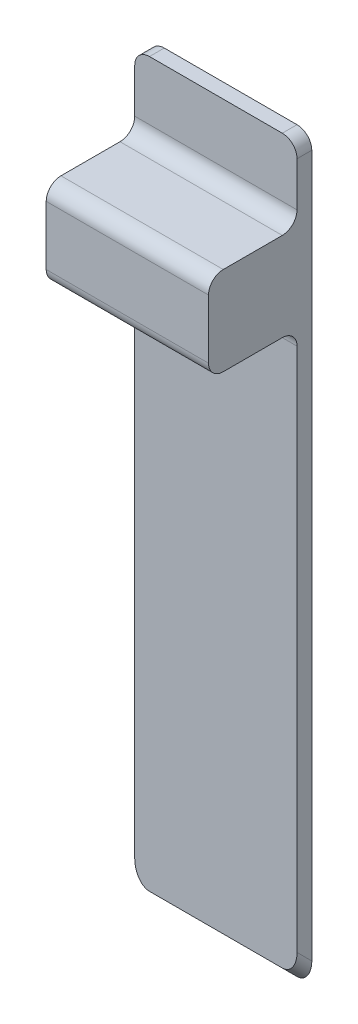
ISO-10303-21;
HEADER;
FILE_DESCRIPTION(('STEP AP214'),'2;1');
FILE_NAME('part.step','',(''),(''),'','','');
FILE_SCHEMA(('AUTOMOTIVE_DESIGN { 1 0 10303 214 1 1 1 1 }'));
ENDSEC;
DATA;
#1=APPLICATION_CONTEXT('core data for automotive mechanical design processes');
#2=APPLICATION_PROTOCOL_DEFINITION('international standard','automotive_design',2000,#1);
#3=PRODUCT_CONTEXT('',#1,'mechanical');
#4=PRODUCT('Part','Part','',(#3));
#5=PRODUCT_RELATED_PRODUCT_CATEGORY('part','',(#4));
#6=PRODUCT_DEFINITION_FORMATION('','',#4);
#7=PRODUCT_DEFINITION_CONTEXT('part definition',#1,'design');
#8=PRODUCT_DEFINITION('design','',#6,#7);
#9=PRODUCT_DEFINITION_SHAPE('','',#8);
#10=(LENGTH_UNIT() NAMED_UNIT(*) SI_UNIT(.MILLI.,.METRE.));
#11=(NAMED_UNIT(*) PLANE_ANGLE_UNIT() SI_UNIT($,.RADIAN.));
#12=(NAMED_UNIT(*) SI_UNIT($,.STERADIAN.) SOLID_ANGLE_UNIT());
#13=UNCERTAINTY_MEASURE_WITH_UNIT(LENGTH_MEASURE(1.E-05),#10,'distance_accuracy_value','');
#14=(GEOMETRIC_REPRESENTATION_CONTEXT(3) GLOBAL_UNCERTAINTY_ASSIGNED_CONTEXT((#13)) GLOBAL_UNIT_ASSIGNED_CONTEXT((#10,
#11,#12)) REPRESENTATION_CONTEXT('',''));
#15=CARTESIAN_POINT('',(0.,0.,0.));
#16=DIRECTION('',(0.,0.,1.));
#17=DIRECTION('',(1.,0.,0.));
#18=AXIS2_PLACEMENT_3D('',#15,#16,#17);
#19=CARTESIAN_POINT('',(0.,0.,1.));
#20=DIRECTION('',(0.,0.,1.));
#21=DIRECTION('',(1.,0.,0.));
#22=AXIS2_PLACEMENT_3D('',#19,#20,#21);
#23=PLANE('',#22);
#24=DIRECTION('',(-1.,0.,0.));
#25=VECTOR('',#24,1.);
#26=CARTESIAN_POINT('',(-5.5,25.,1.));
#27=LINE('',#26,#25);
#28=CARTESIAN_POINT('',(4.5,25.,1.));
#29=VERTEX_POINT('',#28);
#30=CARTESIAN_POINT('',(-4.5,25.,1.));
#31=VERTEX_POINT('',#30);
#32=EDGE_CURVE('E192',#29,#31,#27,.T.);
#33=ORIENTED_EDGE('',*,*,#32,.T.);
#34=CARTESIAN_POINT('',(-4.5,24.,1.));
#35=DIRECTION('',(0.,0.,1.));
#36=DIRECTION('',(1.,0.,0.));
#37=AXIS2_PLACEMENT_3D('',#34,#35,#36);
#38=CIRCLE('',#37,1.);
#39=CARTESIAN_POINT('',(-5.5,24.,1.));
#40=VERTEX_POINT('',#39);
#41=EDGE_CURVE('E219',#31,#40,#38,.T.);
#42=ORIENTED_EDGE('',*,*,#41,.T.);
#43=DIRECTION('',(0.,-1.,0.));
#44=VECTOR('',#43,1.);
#45=CARTESIAN_POINT('',(-5.5,25.,1.));
#46=LINE('',#45,#44);
#47=CARTESIAN_POINT('',(-5.5,21.,1.));
#48=VERTEX_POINT('',#47);
#49=EDGE_CURVE('E175',#40,#48,#46,.T.);
#50=ORIENTED_EDGE('',*,*,#49,.T.);
#51=DIRECTION('',(-1.,0.,0.));
#52=VECTOR('',#51,1.);
#53=CARTESIAN_POINT('',(0.,21.,1.));
#54=LINE('',#53,#52);
#55=CARTESIAN_POINT('',(5.5,21.,1.));
#56=VERTEX_POINT('',#55);
#57=EDGE_CURVE('E215',#48,#56,#54,.F.);
#58=ORIENTED_EDGE('',*,*,#57,.T.);
#59=DIRECTION('',(0.,1.,0.));
#60=VECTOR('',#59,1.);
#61=CARTESIAN_POINT('',(5.5,25.,1.));
#62=LINE('',#61,#60);
#63=CARTESIAN_POINT('',(5.5,24.,1.));
#64=VERTEX_POINT('',#63);
#65=EDGE_CURVE('E267',#56,#64,#62,.T.);
#66=ORIENTED_EDGE('',*,*,#65,.T.);
#67=CARTESIAN_POINT('',(4.5,24.,1.));
#68=DIRECTION('',(0.,0.,1.));
#69=DIRECTION('',(1.,0.,0.));
#70=AXIS2_PLACEMENT_3D('',#67,#68,#69);
#71=CIRCLE('',#70,1.);
#72=EDGE_CURVE('E217',#64,#29,#71,.T.);
#73=ORIENTED_EDGE('',*,*,#72,.T.);
#74=EDGE_LOOP('',(#33,#42,#50,#58,#66,#73));
#75=FACE_BOUND('',#74,.T.);
#76=ADVANCED_FACE('F41',(#75),#23,.T.);
#77=CARTESIAN_POINT('',(-5.5,25.,1.));
#78=DIRECTION('',(1.,0.,0.));
#79=DIRECTION('',(0.,1.,0.));
#80=AXIS2_PLACEMENT_3D('',#77,#78,#79);
#81=PLANE('',#80);
#82=ORIENTED_EDGE('',*,*,#49,.F.);
#83=DIRECTION('',(0.,0.,-1.));
#84=VECTOR('',#83,1.);
#85=CARTESIAN_POINT('',(-5.5,24.,1.));
#86=LINE('',#85,#84);
#87=CARTESIAN_POINT('',(-5.5,24.,0.));
#88=VERTEX_POINT('',#87);
#89=EDGE_CURVE('E158',#40,#88,#86,.T.);
#90=ORIENTED_EDGE('',*,*,#89,.T.);
#91=DIRECTION('',(0.,-1.,0.));
#92=VECTOR('',#91,1.);
#93=CARTESIAN_POINT('',(-5.5,25.,0.));
#94=LINE('',#93,#92);
#95=CARTESIAN_POINT('',(-5.5,-23.5857864376269,0.));
#96=VERTEX_POINT('',#95);
#97=EDGE_CURVE('E172',#88,#96,#94,.T.);
#98=ORIENTED_EDGE('',*,*,#97,.T.);
#99=DIRECTION('',(0.,0.707106781186545,0.70710678118655));
#100=VECTOR('',#99,1.);
#101=CARTESIAN_POINT('',(-5.5,-23.2928932188135,0.292893218813459));
#102=LINE('',#101,#100);
#103=CARTESIAN_POINT('',(-5.5,-22.5857864376269,1.));
#104=VERTEX_POINT('',#103);
#105=EDGE_CURVE('E177',#96,#104,#102,.T.);
#106=ORIENTED_EDGE('',*,*,#105,.T.);
#107=CARTESIAN_POINT('',(-5.5,13.,1.));
#108=VERTEX_POINT('',#107);
#109=EDGE_CURVE('E199',#108,#104,#46,.T.);
#110=ORIENTED_EDGE('',*,*,#109,.F.);
#111=CARTESIAN_POINT('',(-5.5,13.,2.));
#112=DIRECTION('',(1.,0.,0.));
#113=DIRECTION('',(0.,1.,0.));
#114=AXIS2_PLACEMENT_3D('',#111,#112,#113);
#115=CIRCLE('',#114,1.);
#116=CARTESIAN_POINT('',(-5.5,14.,2.));
#117=VERTEX_POINT('',#116);
#118=EDGE_CURVE('E11',#108,#117,#115,.T.);
#119=ORIENTED_EDGE('',*,*,#118,.T.);
#120=DIRECTION('',(0.,0.,-1.));
#121=VECTOR('',#120,1.);
#122=CARTESIAN_POINT('',(-5.5,14.,7.));
#123=LINE('',#122,#121);
#124=CARTESIAN_POINT('',(-5.5,14.,6.));
#125=VERTEX_POINT('',#124);
#126=EDGE_CURVE('E183',#125,#117,#123,.T.);
#127=ORIENTED_EDGE('',*,*,#126,.F.);
#128=CARTESIAN_POINT('',(-5.5,15.,6.));
#129=DIRECTION('',(1.,0.,0.));
#130=DIRECTION('',(0.,1.,0.));
#131=AXIS2_PLACEMENT_3D('',#128,#129,#130);
#132=CIRCLE('',#131,1.);
#133=CARTESIAN_POINT('',(-5.5,15.,7.));
#134=VERTEX_POINT('',#133);
#135=EDGE_CURVE('E205',#125,#134,#132,.F.);
#136=ORIENTED_EDGE('',*,*,#135,.T.);
#137=DIRECTION('',(0.,-1.,0.));
#138=VECTOR('',#137,1.);
#139=CARTESIAN_POINT('',(-5.5,20.,7.));
#140=LINE('',#139,#138);
#141=CARTESIAN_POINT('',(-5.5,19.,7.));
#142=VERTEX_POINT('',#141);
#143=EDGE_CURVE('E279',#142,#134,#140,.T.);
#144=ORIENTED_EDGE('',*,*,#143,.F.);
#145=CARTESIAN_POINT('',(-5.5,19.,6.));
#146=DIRECTION('',(1.,0.,0.));
#147=DIRECTION('',(0.,1.,0.));
#148=AXIS2_PLACEMENT_3D('',#145,#146,#147);
#149=CIRCLE('',#148,1.);
#150=CARTESIAN_POINT('',(-5.5,20.,6.));
#151=VERTEX_POINT('',#150);
#152=EDGE_CURVE('E203',#142,#151,#149,.F.);
#153=ORIENTED_EDGE('',*,*,#152,.T.);
#154=DIRECTION('',(0.,0.,-1.));
#155=VECTOR('',#154,1.);
#156=CARTESIAN_POINT('',(-5.5,20.,7.));
#157=LINE('',#156,#155);
#158=CARTESIAN_POINT('',(-5.5,20.,2.));
#159=VERTEX_POINT('',#158);
#160=EDGE_CURVE('E286',#151,#159,#157,.T.);
#161=ORIENTED_EDGE('',*,*,#160,.T.);
#162=CARTESIAN_POINT('',(-5.5,21.,2.));
#163=DIRECTION('',(1.,0.,0.));
#164=DIRECTION('',(0.,1.,0.));
#165=AXIS2_PLACEMENT_3D('',#162,#163,#164);
#166=CIRCLE('',#165,1.);
#167=EDGE_CURVE('E254',#159,#48,#166,.T.);
#168=ORIENTED_EDGE('',*,*,#167,.T.);
#169=EDGE_LOOP('',(#82,#90,#98,#106,#110,#119,#127,#136,#144,#153,#161,#168));
#170=FACE_BOUND('',#169,.T.);
#171=ADVANCED_FACE('F170',(#170),#81,.F.);
#172=CARTESIAN_POINT('',(5.5,25.,1.));
#173=DIRECTION('',(-1.,0.,0.));
#174=DIRECTION('',(0.,-1.,0.));
#175=AXIS2_PLACEMENT_3D('',#172,#173,#174);
#176=PLANE('',#175);
#177=CARTESIAN_POINT('',(5.5,-22.5857864376269,1.));
#178=VERTEX_POINT('',#177);
#179=CARTESIAN_POINT('',(5.5,13.,1.));
#180=VERTEX_POINT('',#179);
#181=EDGE_CURVE('E260',#178,#180,#62,.T.);
#182=ORIENTED_EDGE('',*,*,#181,.F.);
#183=DIRECTION('',(0.,-0.707106781186545,-0.70710678118655));
#184=VECTOR('',#183,1.);
#185=CARTESIAN_POINT('',(5.5,-24.2928932188135,-0.707106781186548));
#186=LINE('',#185,#184);
#187=CARTESIAN_POINT('',(5.5,-23.5857864376269,0.));
#188=VERTEX_POINT('',#187);
#189=EDGE_CURVE('E236',#178,#188,#186,.T.);
#190=ORIENTED_EDGE('',*,*,#189,.T.);
#191=DIRECTION('',(0.,1.,0.));
#192=VECTOR('',#191,1.);
#193=CARTESIAN_POINT('',(5.5,25.,0.));
#194=LINE('',#193,#192);
#195=CARTESIAN_POINT('',(5.5,24.,0.));
#196=VERTEX_POINT('',#195);
#197=EDGE_CURVE('E186',#188,#196,#194,.T.);
#198=ORIENTED_EDGE('',*,*,#197,.T.);
#199=DIRECTION('',(0.,0.,-1.));
#200=VECTOR('',#199,1.);
#201=CARTESIAN_POINT('',(5.5,24.,1.));
#202=LINE('',#201,#200);
#203=EDGE_CURVE('E234',#196,#64,#202,.F.);
#204=ORIENTED_EDGE('',*,*,#203,.T.);
#205=ORIENTED_EDGE('',*,*,#65,.F.);
#206=CARTESIAN_POINT('',(5.5,21.,2.));
#207=DIRECTION('',(-1.,0.,0.));
#208=DIRECTION('',(0.,-1.,0.));
#209=AXIS2_PLACEMENT_3D('',#206,#207,#208);
#210=CIRCLE('',#209,1.);
#211=CARTESIAN_POINT('',(5.50000000000001,20.,2.));
#212=VERTEX_POINT('',#211);
#213=EDGE_CURVE('E256',#56,#212,#210,.T.);
#214=ORIENTED_EDGE('',*,*,#213,.T.);
#215=DIRECTION('',(0.,0.,-1.));
#216=VECTOR('',#215,1.);
#217=CARTESIAN_POINT('',(5.50000000000001,20.,7.));
#218=LINE('',#217,#216);
#219=CARTESIAN_POINT('',(5.50000000000001,20.,6.));
#220=VERTEX_POINT('',#219);
#221=EDGE_CURVE('E291',#220,#212,#218,.T.);
#222=ORIENTED_EDGE('',*,*,#221,.F.);
#223=CARTESIAN_POINT('',(5.5,19.,6.));
#224=DIRECTION('',(-1.,0.,0.));
#225=DIRECTION('',(0.,-1.,0.));
#226=AXIS2_PLACEMENT_3D('',#223,#224,#225);
#227=CIRCLE('',#226,1.);
#228=CARTESIAN_POINT('',(5.50000000000001,19.,7.));
#229=VERTEX_POINT('',#228);
#230=EDGE_CURVE('E231',#220,#229,#227,.F.);
#231=ORIENTED_EDGE('',*,*,#230,.T.);
#232=DIRECTION('',(0.,1.,0.));
#233=VECTOR('',#232,1.);
#234=CARTESIAN_POINT('',(5.50000000000001,20.,7.));
#235=LINE('',#234,#233);
#236=CARTESIAN_POINT('',(5.5,15.,7.));
#237=VERTEX_POINT('',#236);
#238=EDGE_CURVE('E284',#237,#229,#235,.T.);
#239=ORIENTED_EDGE('',*,*,#238,.F.);
#240=CARTESIAN_POINT('',(5.5,15.,6.));
#241=DIRECTION('',(-1.,0.,0.));
#242=DIRECTION('',(0.,-1.,0.));
#243=AXIS2_PLACEMENT_3D('',#240,#241,#242);
#244=CIRCLE('',#243,1.);
#245=CARTESIAN_POINT('',(5.5,14.,6.));
#246=VERTEX_POINT('',#245);
#247=EDGE_CURVE('E63',#237,#246,#244,.F.);
#248=ORIENTED_EDGE('',*,*,#247,.T.);
#249=DIRECTION('',(0.,0.,-1.));
#250=VECTOR('',#249,1.);
#251=CARTESIAN_POINT('',(5.5,14.,7.));
#252=LINE('',#251,#250);
#253=CARTESIAN_POINT('',(5.5,14.,2.));
#254=VERTEX_POINT('',#253);
#255=EDGE_CURVE('E189',#246,#254,#252,.T.);
#256=ORIENTED_EDGE('',*,*,#255,.T.);
#257=CARTESIAN_POINT('',(5.5,13.,2.));
#258=DIRECTION('',(-1.,0.,0.));
#259=DIRECTION('',(0.,-1.,0.));
#260=AXIS2_PLACEMENT_3D('',#257,#258,#259);
#261=CIRCLE('',#260,1.);
#262=EDGE_CURVE('E49',#254,#180,#261,.T.);
#263=ORIENTED_EDGE('',*,*,#262,.T.);
#264=EDGE_LOOP('',(#182,#190,#198,#204,#205,#214,#222,#231,#239,#248,#256,#263));
#265=FACE_BOUND('',#264,.T.);
#266=ADVANCED_FACE('F259',(#265),#176,.F.);
#267=CARTESIAN_POINT('',(-5.5,25.,1.));
#268=DIRECTION('',(0.,-1.,0.));
#269=DIRECTION('',(0.,0.,-1.));
#270=AXIS2_PLACEMENT_3D('',#267,#268,#269);
#271=PLANE('',#270);
#272=DIRECTION('',(-1.,0.,0.));
#273=VECTOR('',#272,1.);
#274=CARTESIAN_POINT('',(-5.5,25.,0.));
#275=LINE('',#274,#273);
#276=CARTESIAN_POINT('',(4.5,25.,0.));
#277=VERTEX_POINT('',#276);
#278=CARTESIAN_POINT('',(-4.5,25.,0.));
#279=VERTEX_POINT('',#278);
#280=EDGE_CURVE('E197',#277,#279,#275,.T.);
#281=ORIENTED_EDGE('',*,*,#280,.T.);
#282=DIRECTION('',(0.,0.,-1.));
#283=VECTOR('',#282,1.);
#284=CARTESIAN_POINT('',(-4.5,25.,1.));
#285=LINE('',#284,#283);
#286=EDGE_CURVE('E159',#279,#31,#285,.F.);
#287=ORIENTED_EDGE('',*,*,#286,.T.);
#288=ORIENTED_EDGE('',*,*,#32,.F.);
#289=DIRECTION('',(0.,0.,-1.));
#290=VECTOR('',#289,1.);
#291=CARTESIAN_POINT('',(4.5,25.,1.));
#292=LINE('',#291,#290);
#293=EDGE_CURVE('E164',#29,#277,#292,.T.);
#294=ORIENTED_EDGE('',*,*,#293,.T.);
#295=EDGE_LOOP('',(#281,#287,#288,#294));
#296=FACE_BOUND('',#295,.T.);
#297=ADVANCED_FACE('F326',(#296),#271,.F.);
#298=ORIENTED_EDGE('',*,*,#109,.T.);
#299=CARTESIAN_POINT('',(-4.5,-22.5857864376269,1.));
#300=DIRECTION('',(0.,0.,1.));
#301=DIRECTION('',(0.,-1.,0.));
#302=AXIS2_PLACEMENT_3D('',#299,#300,#301);
#303=ELLIPSE('',#302,1.41421356237309,1.);
#304=CARTESIAN_POINT('',(-4.49999999999999,-24.,1.));
#305=VERTEX_POINT('',#304);
#306=EDGE_CURVE('E225',#104,#305,#303,.T.);
#307=ORIENTED_EDGE('',*,*,#306,.T.);
#308=DIRECTION('',(1.,0.,0.));
#309=VECTOR('',#308,1.);
#310=CARTESIAN_POINT('',(5.5,-24.,1.));
#311=LINE('',#310,#309);
#312=CARTESIAN_POINT('',(4.5,-24.,1.));
#313=VERTEX_POINT('',#312);
#314=EDGE_CURVE('E200',#305,#313,#311,.T.);
#315=ORIENTED_EDGE('',*,*,#314,.T.);
#316=CARTESIAN_POINT('',(4.5,-22.5857864376269,1.));
#317=DIRECTION('',(0.,0.,1.));
#318=DIRECTION('',(0.,1.,0.));
#319=AXIS2_PLACEMENT_3D('',#316,#317,#318);
#320=ELLIPSE('',#319,1.41421356237309,1.);
#321=EDGE_CURVE('E223',#313,#178,#320,.T.);
#322=ORIENTED_EDGE('',*,*,#321,.T.);
#323=ORIENTED_EDGE('',*,*,#181,.T.);
#324=DIRECTION('',(1.,0.,0.));
#325=VECTOR('',#324,1.);
#326=CARTESIAN_POINT('',(0.,13.,1.));
#327=LINE('',#326,#325);
#328=EDGE_CURVE('E221',#180,#108,#327,.F.);
#329=ORIENTED_EDGE('',*,*,#328,.T.);
#330=EDGE_LOOP('',(#298,#307,#315,#322,#323,#329));
#331=FACE_BOUND('',#330,.T.);
#332=ADVANCED_FACE('F264',(#331),#23,.T.);
#333=CARTESIAN_POINT('',(0.,0.,0.));
#334=DIRECTION('',(0.,0.,1.));
#335=DIRECTION('',(1.,0.,0.));
#336=AXIS2_PLACEMENT_3D('',#333,#334,#335);
#337=PLANE('',#336);
#338=ORIENTED_EDGE('',*,*,#97,.F.);
#339=CARTESIAN_POINT('',(-4.5,24.,0.));
#340=DIRECTION('',(0.,0.,1.));
#341=DIRECTION('',(1.,0.,0.));
#342=AXIS2_PLACEMENT_3D('',#339,#340,#341);
#343=CIRCLE('',#342,1.);
#344=EDGE_CURVE('E154',#88,#279,#343,.F.);
#345=ORIENTED_EDGE('',*,*,#344,.T.);
#346=ORIENTED_EDGE('',*,*,#280,.F.);
#347=CARTESIAN_POINT('',(4.5,24.,0.));
#348=DIRECTION('',(0.,0.,1.));
#349=DIRECTION('',(1.,0.,0.));
#350=AXIS2_PLACEMENT_3D('',#347,#348,#349);
#351=CIRCLE('',#350,1.);
#352=EDGE_CURVE('E176',#277,#196,#351,.F.);
#353=ORIENTED_EDGE('',*,*,#352,.T.);
#354=ORIENTED_EDGE('',*,*,#197,.F.);
#355=CARTESIAN_POINT('',(4.5,-23.5857864376269,0.));
#356=DIRECTION('',(0.,0.,1.));
#357=DIRECTION('',(0.,1.,0.));
#358=AXIS2_PLACEMENT_3D('',#355,#356,#357);
#359=ELLIPSE('',#358,1.41421356237309,1.);
#360=CARTESIAN_POINT('',(4.5,-25.,0.));
#361=VERTEX_POINT('',#360);
#362=EDGE_CURVE('E209',#188,#361,#359,.F.);
#363=ORIENTED_EDGE('',*,*,#362,.T.);
#364=DIRECTION('',(1.,0.,0.));
#365=VECTOR('',#364,1.);
#366=CARTESIAN_POINT('',(-5.5,-25.,0.));
#367=LINE('',#366,#365);
#368=CARTESIAN_POINT('',(-4.5,-25.,0.));
#369=VERTEX_POINT('',#368);
#370=EDGE_CURVE('E182',#369,#361,#367,.T.);
#371=ORIENTED_EDGE('',*,*,#370,.F.);
#372=CARTESIAN_POINT('',(-4.5,-23.5857864376269,0.));
#373=DIRECTION('',(0.,0.,1.));
#374=DIRECTION('',(0.,-1.,0.));
#375=AXIS2_PLACEMENT_3D('',#372,#373,#374);
#376=ELLIPSE('',#375,1.41421356237309,1.);
#377=EDGE_CURVE('E165',#369,#96,#376,.F.);
#378=ORIENTED_EDGE('',*,*,#377,.T.);
#379=EDGE_LOOP('',(#338,#345,#346,#353,#354,#363,#371,#378));
#380=FACE_BOUND('',#379,.T.);
#381=ADVANCED_FACE('F179',(#380),#337,.F.);
#382=CARTESIAN_POINT('',(0.,-24.,1.));
#383=DIRECTION('',(0.,-0.70710678118655,0.707106781186545));
#384=DIRECTION('',(-1.,0.,0.));
#385=AXIS2_PLACEMENT_3D('',#382,#383,#384);
#386=PLANE('',#385);
#387=ORIENTED_EDGE('',*,*,#314,.F.);
#388=DIRECTION('',(0.,0.707106781186545,0.70710678118655));
#389=VECTOR('',#388,1.);
#390=CARTESIAN_POINT('',(-4.5,-25.,0.));
#391=LINE('',#390,#389);
#392=EDGE_CURVE('E229',#305,#369,#391,.F.);
#393=ORIENTED_EDGE('',*,*,#392,.T.);
#394=ORIENTED_EDGE('',*,*,#370,.T.);
#395=DIRECTION('',(0.,-0.707106781186545,-0.70710678118655));
#396=VECTOR('',#395,1.);
#397=CARTESIAN_POINT('',(4.5,-24.,1.));
#398=LINE('',#397,#396);
#399=EDGE_CURVE('E227',#361,#313,#398,.F.);
#400=ORIENTED_EDGE('',*,*,#399,.T.);
#401=EDGE_LOOP('',(#387,#393,#394,#400));
#402=FACE_BOUND('',#401,.T.);
#403=ADVANCED_FACE('F302',(#402),#386,.T.);
#404=CARTESIAN_POINT('',(-5.5,14.,7.));
#405=DIRECTION('',(0.,1.,0.));
#406=DIRECTION('',(-1.,0.,0.));
#407=AXIS2_PLACEMENT_3D('',#404,#405,#406);
#408=PLANE('',#407);
#409=ORIENTED_EDGE('',*,*,#255,.F.);
#410=DIRECTION('',(1.,0.,0.));
#411=VECTOR('',#410,1.);
#412=CARTESIAN_POINT('',(-5.5,14.,6.));
#413=LINE('',#412,#411);
#414=EDGE_CURVE('E247',#246,#125,#413,.F.);
#415=ORIENTED_EDGE('',*,*,#414,.T.);
#416=ORIENTED_EDGE('',*,*,#126,.T.);
#417=DIRECTION('',(1.,0.,0.));
#418=VECTOR('',#417,1.);
#419=CARTESIAN_POINT('',(-5.5,14.,2.));
#420=LINE('',#419,#418);
#421=EDGE_CURVE('E245',#117,#254,#420,.T.);
#422=ORIENTED_EDGE('',*,*,#421,.T.);
#423=EDGE_LOOP('',(#409,#415,#416,#422));
#424=FACE_BOUND('',#423,.T.);
#425=ADVANCED_FACE('F272',(#424),#408,.F.);
#426=CARTESIAN_POINT('',(-5.5,20.,7.));
#427=DIRECTION('',(0.,-1.,0.));
#428=DIRECTION('',(0.,0.,-1.));
#429=AXIS2_PLACEMENT_3D('',#426,#427,#428);
#430=PLANE('',#429);
#431=ORIENTED_EDGE('',*,*,#160,.F.);
#432=DIRECTION('',(-1.,0.,0.));
#433=VECTOR('',#432,1.);
#434=CARTESIAN_POINT('',(5.50000000000001,20.,6.));
#435=LINE('',#434,#433);
#436=EDGE_CURVE('E252',#151,#220,#435,.F.);
#437=ORIENTED_EDGE('',*,*,#436,.T.);
#438=ORIENTED_EDGE('',*,*,#221,.T.);
#439=DIRECTION('',(-1.,0.,0.));
#440=VECTOR('',#439,1.);
#441=CARTESIAN_POINT('',(-5.5,20.,2.));
#442=LINE('',#441,#440);
#443=EDGE_CURVE('E249',#212,#159,#442,.T.);
#444=ORIENTED_EDGE('',*,*,#443,.T.);
#445=EDGE_LOOP('',(#431,#437,#438,#444));
#446=FACE_BOUND('',#445,.T.);
#447=ADVANCED_FACE('F345',(#446),#430,.F.);
#448=CARTESIAN_POINT('',(0.,0.,7.));
#449=DIRECTION('',(0.,0.,1.));
#450=DIRECTION('',(1.,0.,0.));
#451=AXIS2_PLACEMENT_3D('',#448,#449,#450);
#452=PLANE('',#451);
#453=ORIENTED_EDGE('',*,*,#143,.T.);
#454=DIRECTION('',(1.,0.,0.));
#455=VECTOR('',#454,1.);
#456=CARTESIAN_POINT('',(5.5,15.,7.));
#457=LINE('',#456,#455);
#458=EDGE_CURVE('E242',#134,#237,#457,.T.);
#459=ORIENTED_EDGE('',*,*,#458,.T.);
#460=ORIENTED_EDGE('',*,*,#238,.T.);
#461=DIRECTION('',(-1.,0.,0.));
#462=VECTOR('',#461,1.);
#463=CARTESIAN_POINT('',(-5.5,19.,7.));
#464=LINE('',#463,#462);
#465=EDGE_CURVE('E239',#229,#142,#464,.T.);
#466=ORIENTED_EDGE('',*,*,#465,.T.);
#467=EDGE_LOOP('',(#453,#459,#460,#466));
#468=FACE_BOUND('',#467,.T.);
#469=ADVANCED_FACE('F281',(#468),#452,.T.);
#470=CARTESIAN_POINT('',(-4.5,24.,1.));
#471=DIRECTION('',(0.,0.,-1.));
#472=DIRECTION('',(-1.,0.,0.));
#473=AXIS2_PLACEMENT_3D('',#470,#471,#472);
#474=CYLINDRICAL_SURFACE('',#473,1.);
#475=ORIENTED_EDGE('',*,*,#41,.F.);
#476=ORIENTED_EDGE('',*,*,#286,.F.);
#477=ORIENTED_EDGE('',*,*,#344,.F.);
#478=ORIENTED_EDGE('',*,*,#89,.F.);
#479=EDGE_LOOP('',(#475,#476,#477,#478));
#480=FACE_BOUND('',#479,.T.);
#481=ADVANCED_FACE('F157',(#480),#474,.T.);
#482=CARTESIAN_POINT('',(-4.5,1.20710678118637,24.7928932188135));
#483=DIRECTION('',(0.,-0.707106781186545,-0.70710678118655));
#484=DIRECTION('',(0.,0.70710678118655,-0.707106781186545));
#485=AXIS2_PLACEMENT_3D('',#482,#483,#484);
#486=CYLINDRICAL_SURFACE('',#485,1.);
#487=ORIENTED_EDGE('',*,*,#377,.F.);
#488=ORIENTED_EDGE('',*,*,#392,.F.);
#489=ORIENTED_EDGE('',*,*,#306,.F.);
#490=ORIENTED_EDGE('',*,*,#105,.F.);
#491=EDGE_LOOP('',(#487,#488,#489,#490));
#492=FACE_BOUND('',#491,.T.);
#493=ADVANCED_FACE('F304',(#492),#486,.T.);
#494=CARTESIAN_POINT('',(4.5,1.20710678118637,24.7928932188135));
#495=DIRECTION('',(0.,0.707106781186545,0.70710678118655));
#496=DIRECTION('',(0.,-0.70710678118655,0.707106781186545));
#497=AXIS2_PLACEMENT_3D('',#494,#495,#496);
#498=CYLINDRICAL_SURFACE('',#497,1.);
#499=ORIENTED_EDGE('',*,*,#321,.F.);
#500=ORIENTED_EDGE('',*,*,#399,.F.);
#501=ORIENTED_EDGE('',*,*,#362,.F.);
#502=ORIENTED_EDGE('',*,*,#189,.F.);
#503=EDGE_LOOP('',(#499,#500,#501,#502));
#504=FACE_BOUND('',#503,.T.);
#505=ADVANCED_FACE('F306',(#504),#498,.T.);
#506=CARTESIAN_POINT('',(4.5,24.,1.));
#507=DIRECTION('',(0.,0.,-1.));
#508=DIRECTION('',(-1.,0.,0.));
#509=AXIS2_PLACEMENT_3D('',#506,#507,#508);
#510=CYLINDRICAL_SURFACE('',#509,1.);
#511=ORIENTED_EDGE('',*,*,#72,.F.);
#512=ORIENTED_EDGE('',*,*,#203,.F.);
#513=ORIENTED_EDGE('',*,*,#352,.F.);
#514=ORIENTED_EDGE('',*,*,#293,.F.);
#515=EDGE_LOOP('',(#511,#512,#513,#514));
#516=FACE_BOUND('',#515,.T.);
#517=ADVANCED_FACE('F312',(#516),#510,.T.);
#518=CARTESIAN_POINT('',(0.,15.,6.));
#519=DIRECTION('',(-1.,0.,0.));
#520=DIRECTION('',(0.,-1.,0.));
#521=AXIS2_PLACEMENT_3D('',#518,#519,#520);
#522=CYLINDRICAL_SURFACE('',#521,1.);
#523=ORIENTED_EDGE('',*,*,#135,.F.);
#524=ORIENTED_EDGE('',*,*,#414,.F.);
#525=ORIENTED_EDGE('',*,*,#247,.F.);
#526=ORIENTED_EDGE('',*,*,#458,.F.);
#527=EDGE_LOOP('',(#523,#524,#525,#526));
#528=FACE_BOUND('',#527,.T.);
#529=ADVANCED_FACE('F275',(#528),#522,.T.);
#530=CARTESIAN_POINT('',(0.,19.,6.));
#531=DIRECTION('',(1.,0.,0.));
#532=DIRECTION('',(0.,0.,-1.));
#533=AXIS2_PLACEMENT_3D('',#530,#531,#532);
#534=CYLINDRICAL_SURFACE('',#533,1.);
#535=ORIENTED_EDGE('',*,*,#230,.F.);
#536=ORIENTED_EDGE('',*,*,#436,.F.);
#537=ORIENTED_EDGE('',*,*,#152,.F.);
#538=ORIENTED_EDGE('',*,*,#465,.F.);
#539=EDGE_LOOP('',(#535,#536,#537,#538));
#540=FACE_BOUND('',#539,.T.);
#541=ADVANCED_FACE('F391',(#540),#534,.T.);
#542=CARTESIAN_POINT('',(-5.5,21.,2.));
#543=DIRECTION('',(-1.,0.,0.));
#544=DIRECTION('',(0.,0.,1.));
#545=AXIS2_PLACEMENT_3D('',#542,#543,#544);
#546=CYLINDRICAL_SURFACE('',#545,1.);
#547=ORIENTED_EDGE('',*,*,#213,.F.);
#548=ORIENTED_EDGE('',*,*,#57,.F.);
#549=ORIENTED_EDGE('',*,*,#167,.F.);
#550=ORIENTED_EDGE('',*,*,#443,.F.);
#551=EDGE_LOOP('',(#547,#548,#549,#550));
#552=FACE_BOUND('',#551,.T.);
#553=ADVANCED_FACE('F400',(#552),#546,.F.);
#554=CARTESIAN_POINT('',(-5.5,13.,2.));
#555=DIRECTION('',(1.,0.,0.));
#556=DIRECTION('',(0.,1.,0.));
#557=AXIS2_PLACEMENT_3D('',#554,#555,#556);
#558=CYLINDRICAL_SURFACE('',#557,1.);
#559=ORIENTED_EDGE('',*,*,#118,.F.);
#560=ORIENTED_EDGE('',*,*,#328,.F.);
#561=ORIENTED_EDGE('',*,*,#262,.F.);
#562=ORIENTED_EDGE('',*,*,#421,.F.);
#563=EDGE_LOOP('',(#559,#560,#561,#562));
#564=FACE_BOUND('',#563,.T.);
#565=ADVANCED_FACE('F43',(#564),#558,.F.);
#566=CLOSED_SHELL('',(#76,#171,#266,#297,#332,#381,#403,#425,#447,#469,#481,#493,#505,#517,#529,
#541,#553,#565));
#567=MANIFOLD_SOLID_BREP('B2',#566);
#568=ADVANCED_BREP_SHAPE_REPRESENTATION('',(#18,#567),#14);
#569=SHAPE_DEFINITION_REPRESENTATION(#9,#568);
ENDSEC;
END-ISO-10303-21;
